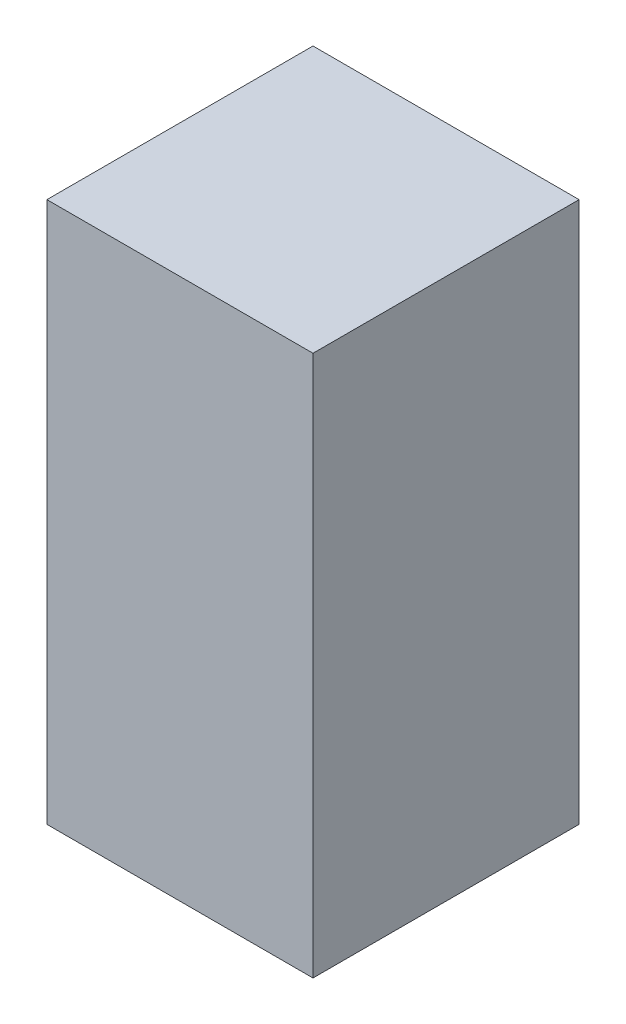
ISO-10303-21;
HEADER;
FILE_DESCRIPTION(('STEP AP214'),'2;1');
FILE_NAME('part.step','',(''),(''),'','','');
FILE_SCHEMA(('AUTOMOTIVE_DESIGN { 1 0 10303 214 1 1 1 1 }'));
ENDSEC;
DATA;
#1=APPLICATION_CONTEXT('core data for automotive mechanical design processes');
#2=APPLICATION_PROTOCOL_DEFINITION('international standard','automotive_design',2000,#1);
#3=PRODUCT_CONTEXT('',#1,'mechanical');
#4=PRODUCT('Part','Part','',(#3));
#5=PRODUCT_RELATED_PRODUCT_CATEGORY('part','',(#4));
#6=PRODUCT_DEFINITION_FORMATION('','',#4);
#7=PRODUCT_DEFINITION_CONTEXT('part definition',#1,'design');
#8=PRODUCT_DEFINITION('design','',#6,#7);
#9=PRODUCT_DEFINITION_SHAPE('','',#8);
#10=(LENGTH_UNIT() NAMED_UNIT(*) SI_UNIT(.MILLI.,.METRE.));
#11=(NAMED_UNIT(*) PLANE_ANGLE_UNIT() SI_UNIT($,.RADIAN.));
#12=(NAMED_UNIT(*) SI_UNIT($,.STERADIAN.) SOLID_ANGLE_UNIT());
#13=UNCERTAINTY_MEASURE_WITH_UNIT(LENGTH_MEASURE(1.E-05),#10,'distance_accuracy_value','');
#14=(GEOMETRIC_REPRESENTATION_CONTEXT(3) GLOBAL_UNCERTAINTY_ASSIGNED_CONTEXT((#13)) GLOBAL_UNIT_ASSIGNED_CONTEXT((#10,
#11,#12)) REPRESENTATION_CONTEXT('',''));
#15=CARTESIAN_POINT('',(0.,0.,0.));
#16=DIRECTION('',(0.,0.,1.));
#17=DIRECTION('',(1.,0.,0.));
#18=AXIS2_PLACEMENT_3D('',#15,#16,#17);
#19=CARTESIAN_POINT('',(-150.,610.,150.));
#20=DIRECTION('',(0.,0.,-1.));
#21=DIRECTION('',(-1.,0.,0.));
#22=AXIS2_PLACEMENT_3D('',#19,#20,#21);
#23=PLANE('',#22);
#24=DIRECTION('',(1.,0.,0.));
#25=VECTOR('',#24,1.);
#26=CARTESIAN_POINT('',(-150.,0.,150.));
#27=LINE('',#26,#25);
#28=CARTESIAN_POINT('',(-150.,0.,150.));
#29=VERTEX_POINT('',#28);
#30=CARTESIAN_POINT('',(150.,0.,150.));
#31=VERTEX_POINT('',#30);
#32=EDGE_CURVE('E100',#29,#31,#27,.T.);
#33=ORIENTED_EDGE('',*,*,#32,.T.);
#34=DIRECTION('',(0.,-1.,0.));
#35=VECTOR('',#34,1.);
#36=CARTESIAN_POINT('',(150.,610.,150.));
#37=LINE('',#36,#35);
#38=CARTESIAN_POINT('',(150.,610.,150.));
#39=VERTEX_POINT('',#38);
#40=EDGE_CURVE('E11',#39,#31,#37,.T.);
#41=ORIENTED_EDGE('',*,*,#40,.F.);
#42=DIRECTION('',(1.,0.,0.));
#43=VECTOR('',#42,1.);
#44=CARTESIAN_POINT('',(-150.,610.,150.));
#45=LINE('',#44,#43);
#46=CARTESIAN_POINT('',(-150.,610.,150.));
#47=VERTEX_POINT('',#46);
#48=EDGE_CURVE('E86',#47,#39,#45,.T.);
#49=ORIENTED_EDGE('',*,*,#48,.F.);
#50=DIRECTION('',(0.,-1.,0.));
#51=VECTOR('',#50,1.);
#52=CARTESIAN_POINT('',(-150.,610.,150.));
#53=LINE('',#52,#51);
#54=EDGE_CURVE('E53',#47,#29,#53,.T.);
#55=ORIENTED_EDGE('',*,*,#54,.T.);
#56=EDGE_LOOP('',(#33,#41,#49,#55));
#57=FACE_BOUND('',#56,.T.);
#58=ADVANCED_FACE('F37',(#57),#23,.F.);
#59=CARTESIAN_POINT('',(150.,610.,150.));
#60=DIRECTION('',(-1.,0.,0.));
#61=DIRECTION('',(0.,0.,1.));
#62=AXIS2_PLACEMENT_3D('',#59,#60,#61);
#63=PLANE('',#62);
#64=DIRECTION('',(0.,0.,-1.));
#65=VECTOR('',#64,1.);
#66=CARTESIAN_POINT('',(150.,0.,150.));
#67=LINE('',#66,#65);
#68=CARTESIAN_POINT('',(150.,0.,-150.));
#69=VERTEX_POINT('',#68);
#70=EDGE_CURVE('E91',#31,#69,#67,.T.);
#71=ORIENTED_EDGE('',*,*,#70,.T.);
#72=DIRECTION('',(0.,-1.,0.));
#73=VECTOR('',#72,1.);
#74=CARTESIAN_POINT('',(150.,610.,-150.));
#75=LINE('',#74,#73);
#76=CARTESIAN_POINT('',(150.,610.,-150.));
#77=VERTEX_POINT('',#76);
#78=EDGE_CURVE('E45',#77,#69,#75,.T.);
#79=ORIENTED_EDGE('',*,*,#78,.F.);
#80=DIRECTION('',(0.,0.,-1.));
#81=VECTOR('',#80,1.);
#82=CARTESIAN_POINT('',(150.,610.,150.));
#83=LINE('',#82,#81);
#84=EDGE_CURVE('E78',#39,#77,#83,.T.);
#85=ORIENTED_EDGE('',*,*,#84,.F.);
#86=ORIENTED_EDGE('',*,*,#40,.T.);
#87=EDGE_LOOP('',(#71,#79,#85,#86));
#88=FACE_BOUND('',#87,.T.);
#89=ADVANCED_FACE('F90',(#88),#63,.F.);
#90=CARTESIAN_POINT('',(-150.,610.,-150.));
#91=DIRECTION('',(0.,0.,-1.));
#92=DIRECTION('',(-1.,0.,0.));
#93=AXIS2_PLACEMENT_3D('',#90,#91,#92);
#94=PLANE('',#93);
#95=DIRECTION('',(1.,0.,0.));
#96=VECTOR('',#95,1.);
#97=CARTESIAN_POINT('',(-150.,0.,-150.));
#98=LINE('',#97,#96);
#99=CARTESIAN_POINT('',(-150.,0.,-150.));
#100=VERTEX_POINT('',#99);
#101=EDGE_CURVE('E103',#100,#69,#98,.T.);
#102=ORIENTED_EDGE('',*,*,#101,.F.);
#103=DIRECTION('',(0.,-1.,0.));
#104=VECTOR('',#103,1.);
#105=CARTESIAN_POINT('',(-150.,610.,-150.));
#106=LINE('',#105,#104);
#107=CARTESIAN_POINT('',(-150.,610.,-150.));
#108=VERTEX_POINT('',#107);
#109=EDGE_CURVE('E67',#108,#100,#106,.T.);
#110=ORIENTED_EDGE('',*,*,#109,.F.);
#111=DIRECTION('',(1.,0.,0.));
#112=VECTOR('',#111,1.);
#113=CARTESIAN_POINT('',(-150.,610.,-150.));
#114=LINE('',#113,#112);
#115=EDGE_CURVE('E85',#108,#77,#114,.T.);
#116=ORIENTED_EDGE('',*,*,#115,.T.);
#117=ORIENTED_EDGE('',*,*,#78,.T.);
#118=EDGE_LOOP('',(#102,#110,#116,#117));
#119=FACE_BOUND('',#118,.T.);
#120=ADVANCED_FACE('F94',(#119),#94,.T.);
#121=CARTESIAN_POINT('',(-150.,610.,150.));
#122=DIRECTION('',(-1.,0.,0.));
#123=DIRECTION('',(0.,0.,1.));
#124=AXIS2_PLACEMENT_3D('',#121,#122,#123);
#125=PLANE('',#124);
#126=DIRECTION('',(0.,0.,-1.));
#127=VECTOR('',#126,1.);
#128=CARTESIAN_POINT('',(-150.,0.,150.));
#129=LINE('',#128,#127);
#130=EDGE_CURVE('E105',#29,#100,#129,.T.);
#131=ORIENTED_EDGE('',*,*,#130,.F.);
#132=ORIENTED_EDGE('',*,*,#54,.F.);
#133=DIRECTION('',(0.,0.,-1.));
#134=VECTOR('',#133,1.);
#135=CARTESIAN_POINT('',(-150.,610.,150.));
#136=LINE('',#135,#134);
#137=EDGE_CURVE('E95',#47,#108,#136,.T.);
#138=ORIENTED_EDGE('',*,*,#137,.T.);
#139=ORIENTED_EDGE('',*,*,#109,.T.);
#140=EDGE_LOOP('',(#131,#132,#138,#139));
#141=FACE_BOUND('',#140,.T.);
#142=ADVANCED_FACE('F111',(#141),#125,.T.);
#143=CARTESIAN_POINT('',(0.,610.,0.));
#144=DIRECTION('',(0.,1.,0.));
#145=DIRECTION('',(0.,0.,1.));
#146=AXIS2_PLACEMENT_3D('',#143,#144,#145);
#147=PLANE('',#146);
#148=ORIENTED_EDGE('',*,*,#48,.T.);
#149=ORIENTED_EDGE('',*,*,#84,.T.);
#150=ORIENTED_EDGE('',*,*,#115,.F.);
#151=ORIENTED_EDGE('',*,*,#137,.F.);
#152=EDGE_LOOP('',(#148,#149,#150,#151));
#153=FACE_BOUND('',#152,.T.);
#154=ADVANCED_FACE('F82',(#153),#147,.T.);
#155=CARTESIAN_POINT('',(0.,0.,0.));
#156=DIRECTION('',(0.,1.,0.));
#157=DIRECTION('',(0.,0.,1.));
#158=AXIS2_PLACEMENT_3D('',#155,#156,#157);
#159=PLANE('',#158);
#160=ORIENTED_EDGE('',*,*,#32,.F.);
#161=ORIENTED_EDGE('',*,*,#130,.T.);
#162=ORIENTED_EDGE('',*,*,#101,.T.);
#163=ORIENTED_EDGE('',*,*,#70,.F.);
#164=EDGE_LOOP('',(#160,#161,#162,#163));
#165=FACE_BOUND('',#164,.T.);
#166=ADVANCED_FACE('F110',(#165),#159,.F.);
#167=CLOSED_SHELL('',(#58,#89,#120,#142,#154,#166));
#168=MANIFOLD_SOLID_BREP('B2',#167);
#169=ADVANCED_BREP_SHAPE_REPRESENTATION('',(#18,#168),#14);
#170=SHAPE_DEFINITION_REPRESENTATION(#9,#169);
ENDSEC;
END-ISO-10303-21;
